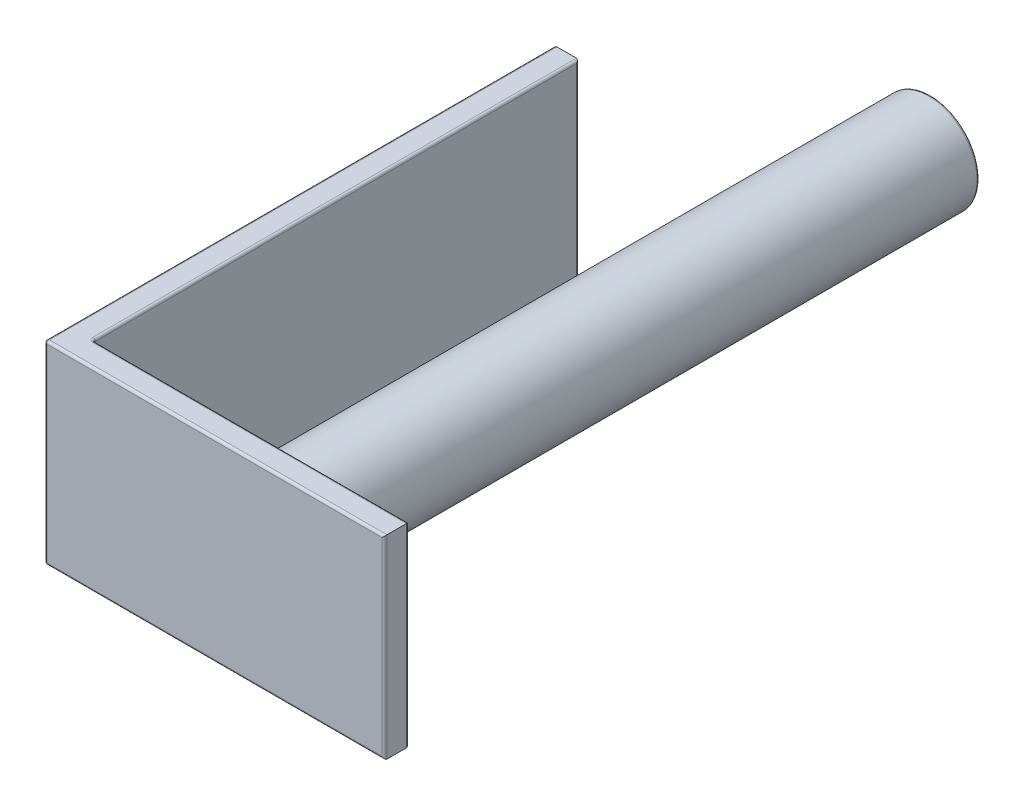
ISO-10303-21;
HEADER;
FILE_DESCRIPTION(('STEP AP214'),'2;1');
FILE_NAME('part.step','',(''),(''),'','','');
FILE_SCHEMA(('AUTOMOTIVE_DESIGN { 1 0 10303 214 1 1 1 1 }'));
ENDSEC;
DATA;
#1=APPLICATION_CONTEXT('core data for automotive mechanical design processes');
#2=APPLICATION_PROTOCOL_DEFINITION('international standard','automotive_design',2000,#1);
#3=PRODUCT_CONTEXT('',#1,'mechanical');
#4=PRODUCT('Part','Part','',(#3));
#5=PRODUCT_RELATED_PRODUCT_CATEGORY('part','',(#4));
#6=PRODUCT_DEFINITION_FORMATION('','',#4);
#7=PRODUCT_DEFINITION_CONTEXT('part definition',#1,'design');
#8=PRODUCT_DEFINITION('design','',#6,#7);
#9=PRODUCT_DEFINITION_SHAPE('','',#8);
#10=(LENGTH_UNIT() NAMED_UNIT(*) SI_UNIT(.MILLI.,.METRE.));
#11=(NAMED_UNIT(*) PLANE_ANGLE_UNIT() SI_UNIT($,.RADIAN.));
#12=(NAMED_UNIT(*) SI_UNIT($,.STERADIAN.) SOLID_ANGLE_UNIT());
#13=UNCERTAINTY_MEASURE_WITH_UNIT(LENGTH_MEASURE(1.E-05),#10,'distance_accuracy_value','');
#14=(GEOMETRIC_REPRESENTATION_CONTEXT(3) GLOBAL_UNCERTAINTY_ASSIGNED_CONTEXT((#13)) GLOBAL_UNIT_ASSIGNED_CONTEXT((#10,
#11,#12)) REPRESENTATION_CONTEXT('',''));
#15=CARTESIAN_POINT('',(0.,0.,0.));
#16=DIRECTION('',(0.,0.,1.));
#17=DIRECTION('',(1.,0.,0.));
#18=AXIS2_PLACEMENT_3D('',#15,#16,#17);
#19=CARTESIAN_POINT('',(0.,0.,-711.2));
#20=DIRECTION('',(0.,0.,1.));
#21=DIRECTION('',(1.,0.,0.));
#22=AXIS2_PLACEMENT_3D('',#19,#20,#21);
#23=CYLINDRICAL_SURFACE('',#22,50.8);
#24=CARTESIAN_POINT('',(0.,0.,-2.5400000000001));
#25=DIRECTION('',(0.,0.,1.));
#26=DIRECTION('',(1.,0.,0.));
#27=AXIS2_PLACEMENT_3D('',#24,#25,#26);
#28=CIRCLE('',#27,50.8);
#29=CARTESIAN_POINT('',(50.8,0.,-2.54000000000011));
#30=VERTEX_POINT('',#29);
#31=EDGE_CURVE('E244',#30,#30,#28,.F.);
#32=ORIENTED_EDGE('',*,*,#31,.T.);
#33=EDGE_LOOP('',(#32));
#34=FACE_BOUND('',#33,.T.);
#35=CARTESIAN_POINT('',(0.,0.,-708.66));
#36=DIRECTION('',(0.,0.,1.));
#37=DIRECTION('',(1.,0.,0.));
#38=AXIS2_PLACEMENT_3D('',#35,#36,#37);
#39=CIRCLE('',#38,50.8);
#40=CARTESIAN_POINT('',(50.8,0.,-708.66));
#41=VERTEX_POINT('',#40);
#42=EDGE_CURVE('E241',#41,#41,#39,.T.);
#43=ORIENTED_EDGE('',*,*,#42,.T.);
#44=EDGE_LOOP('',(#43));
#45=FACE_BOUND('',#44,.T.);
#46=ADVANCED_FACE('F39',(#34,#45),#23,.T.);
#47=CARTESIAN_POINT('',(0.,0.,-711.2));
#48=DIRECTION('',(0.,0.,1.));
#49=DIRECTION('',(1.,0.,0.));
#50=AXIS2_PLACEMENT_3D('',#47,#48,#49);
#51=PLANE('',#50);
#52=CARTESIAN_POINT('',(0.,0.,-711.2));
#53=DIRECTION('',(0.,0.,1.));
#54=DIRECTION('',(1.,0.,0.));
#55=AXIS2_PLACEMENT_3D('',#52,#53,#54);
#56=CIRCLE('',#55,48.26);
#57=CARTESIAN_POINT('',(48.26,0.,-711.2));
#58=VERTEX_POINT('',#57);
#59=EDGE_CURVE('E247',#58,#58,#56,.F.);
#60=ORIENTED_EDGE('',*,*,#59,.T.);
#61=EDGE_LOOP('',(#60));
#62=FACE_BOUND('',#61,.T.);
#63=ADVANCED_FACE('F347',(#62),#51,.F.);
#64=CARTESIAN_POINT('',(-165.1,101.6,0.));
#65=DIRECTION('',(-1.,0.,0.));
#66=DIRECTION('',(0.,0.,1.));
#67=AXIS2_PLACEMENT_3D('',#64,#65,#66);
#68=PLANE('',#67);
#69=DIRECTION('',(0.,-1.,0.));
#70=VECTOR('',#69,1.);
#71=CARTESIAN_POINT('',(-165.1,-101.6,-2.53999999999995));
#72=LINE('',#71,#70);
#73=CARTESIAN_POINT('',(-165.1,99.06,-2.53999999999995));
#74=VERTEX_POINT('',#73);
#75=CARTESIAN_POINT('',(-165.1,-99.06,-2.53999999999995));
#76=VERTEX_POINT('',#75);
#77=EDGE_CURVE('E166',#74,#76,#72,.T.);
#78=ORIENTED_EDGE('',*,*,#77,.T.);
#79=DIRECTION('',(0.,0.,-1.));
#80=VECTOR('',#79,1.);
#81=CARTESIAN_POINT('',(-165.1,-99.06,-508.));
#82=LINE('',#81,#80);
#83=CARTESIAN_POINT('',(-165.1,-99.06,-505.46));
#84=VERTEX_POINT('',#83);
#85=EDGE_CURVE('E64',#76,#84,#82,.T.);
#86=ORIENTED_EDGE('',*,*,#85,.T.);
#87=DIRECTION('',(0.,-1.,0.));
#88=VECTOR('',#87,1.);
#89=CARTESIAN_POINT('',(-165.1,101.6,-505.46));
#90=LINE('',#89,#88);
#91=CARTESIAN_POINT('',(-165.1,99.06,-505.46));
#92=VERTEX_POINT('',#91);
#93=EDGE_CURVE('E252',#84,#92,#90,.F.);
#94=ORIENTED_EDGE('',*,*,#93,.T.);
#95=DIRECTION('',(0.,0.,-1.));
#96=VECTOR('',#95,1.);
#97=CARTESIAN_POINT('',(-165.1,99.06,0.));
#98=LINE('',#97,#96);
#99=EDGE_CURVE('E250',#92,#74,#98,.F.);
#100=ORIENTED_EDGE('',*,*,#99,.T.);
#101=EDGE_LOOP('',(#78,#86,#94,#100));
#102=FACE_BOUND('',#101,.T.);
#103=ADVANCED_FACE('F353',(#102),#68,.F.);
#104=CARTESIAN_POINT('',(-190.5,101.6,-508.));
#105=DIRECTION('',(0.,0.,-1.));
#106=DIRECTION('',(-1.,0.,0.));
#107=AXIS2_PLACEMENT_3D('',#104,#105,#106);
#108=PLANE('',#107);
#109=DIRECTION('',(1.,0.,0.));
#110=VECTOR('',#109,1.);
#111=CARTESIAN_POINT('',(-190.5,-101.6,-508.));
#112=LINE('',#111,#110);
#113=CARTESIAN_POINT('',(-187.96,-101.6,-508.));
#114=VERTEX_POINT('',#113);
#115=CARTESIAN_POINT('',(-167.64,-101.6,-508.));
#116=VERTEX_POINT('',#115);
#117=EDGE_CURVE('E271',#114,#116,#112,.T.);
#118=ORIENTED_EDGE('',*,*,#117,.F.);
#119=DIRECTION('',(0.,-1.,0.));
#120=VECTOR('',#119,1.);
#121=CARTESIAN_POINT('',(-187.96,101.6,-508.));
#122=LINE('',#121,#120);
#123=CARTESIAN_POINT('',(-187.96,101.6,-508.));
#124=VERTEX_POINT('',#123);
#125=EDGE_CURVE('E11',#114,#124,#122,.F.);
#126=ORIENTED_EDGE('',*,*,#125,.T.);
#127=DIRECTION('',(1.,0.,0.));
#128=VECTOR('',#127,1.);
#129=CARTESIAN_POINT('',(-190.5,101.6,-508.));
#130=LINE('',#129,#128);
#131=CARTESIAN_POINT('',(-167.64,101.6,-508.));
#132=VERTEX_POINT('',#131);
#133=EDGE_CURVE('E188',#124,#132,#130,.T.);
#134=ORIENTED_EDGE('',*,*,#133,.T.);
#135=DIRECTION('',(0.,-1.,0.));
#136=VECTOR('',#135,1.);
#137=CARTESIAN_POINT('',(-167.64,-101.6,-508.));
#138=LINE('',#137,#136);
#139=EDGE_CURVE('E48',#132,#116,#138,.T.);
#140=ORIENTED_EDGE('',*,*,#139,.T.);
#141=EDGE_LOOP('',(#118,#126,#134,#140));
#142=FACE_BOUND('',#141,.T.);
#143=ADVANCED_FACE('F597',(#142),#108,.T.);
#144=CARTESIAN_POINT('',(-190.5,101.6,0.));
#145=DIRECTION('',(-1.,0.,0.));
#146=DIRECTION('',(0.,0.,1.));
#147=AXIS2_PLACEMENT_3D('',#144,#145,#146);
#148=PLANE('',#147);
#149=DIRECTION('',(0.,-1.,0.));
#150=VECTOR('',#149,1.);
#151=CARTESIAN_POINT('',(-190.5,101.6,22.8600000000001));
#152=LINE('',#151,#150);
#153=CARTESIAN_POINT('',(-190.5,-99.06,22.8600000000001));
#154=VERTEX_POINT('',#153);
#155=CARTESIAN_POINT('',(-190.5,99.06,22.8600000000001));
#156=VERTEX_POINT('',#155);
#157=EDGE_CURVE('E222',#154,#156,#152,.F.);
#158=ORIENTED_EDGE('',*,*,#157,.T.);
#159=DIRECTION('',(0.,0.,-1.));
#160=VECTOR('',#159,1.);
#161=CARTESIAN_POINT('',(-190.5,99.06,-508.));
#162=LINE('',#161,#160);
#163=CARTESIAN_POINT('',(-190.5,99.06,-505.46));
#164=VERTEX_POINT('',#163);
#165=EDGE_CURVE('E225',#156,#164,#162,.T.);
#166=ORIENTED_EDGE('',*,*,#165,.T.);
#167=DIRECTION('',(0.,-1.,0.));
#168=VECTOR('',#167,1.);
#169=CARTESIAN_POINT('',(-190.5,101.6,-505.46));
#170=LINE('',#169,#168);
#171=CARTESIAN_POINT('',(-190.5,-99.06,-505.46));
#172=VERTEX_POINT('',#171);
#173=EDGE_CURVE('E220',#164,#172,#170,.T.);
#174=ORIENTED_EDGE('',*,*,#173,.T.);
#175=DIRECTION('',(0.,0.,-1.));
#176=VECTOR('',#175,1.);
#177=CARTESIAN_POINT('',(-190.5,-99.06,0.));
#178=LINE('',#177,#176);
#179=EDGE_CURVE('E218',#172,#154,#178,.F.);
#180=ORIENTED_EDGE('',*,*,#179,.T.);
#181=EDGE_LOOP('',(#158,#166,#174,#180));
#182=FACE_BOUND('',#181,.T.);
#183=ADVANCED_FACE('F313',(#182),#148,.T.);
#184=CARTESIAN_POINT('',(165.1,101.6,25.3999999999999));
#185=DIRECTION('',(0.,0.,1.));
#186=DIRECTION('',(1.,0.,0.));
#187=AXIS2_PLACEMENT_3D('',#184,#185,#186);
#188=PLANE('',#187);
#189=DIRECTION('',(-1.,0.,0.));
#190=VECTOR('',#189,1.);
#191=CARTESIAN_POINT('',(-190.5,99.06,25.4000000000001));
#192=LINE('',#191,#190);
#193=CARTESIAN_POINT('',(162.56,99.06,25.3999999999999));
#194=VERTEX_POINT('',#193);
#195=CARTESIAN_POINT('',(-187.96,99.06,25.4000000000001));
#196=VERTEX_POINT('',#195);
#197=EDGE_CURVE('E213',#194,#196,#192,.T.);
#198=ORIENTED_EDGE('',*,*,#197,.T.);
#199=DIRECTION('',(0.,-1.,0.));
#200=VECTOR('',#199,1.);
#201=CARTESIAN_POINT('',(-187.96,101.6,25.4000000000001));
#202=LINE('',#201,#200);
#203=CARTESIAN_POINT('',(-187.96,-99.06,25.4000000000001));
#204=VERTEX_POINT('',#203);
#205=EDGE_CURVE('E215',#196,#204,#202,.T.);
#206=ORIENTED_EDGE('',*,*,#205,.T.);
#207=DIRECTION('',(-1.,0.,0.));
#208=VECTOR('',#207,1.);
#209=CARTESIAN_POINT('',(165.1,-99.06,25.3999999999999));
#210=LINE('',#209,#208);
#211=CARTESIAN_POINT('',(162.56,-99.06,25.3999999999999));
#212=VERTEX_POINT('',#211);
#213=EDGE_CURVE('E209',#204,#212,#210,.F.);
#214=ORIENTED_EDGE('',*,*,#213,.T.);
#215=DIRECTION('',(0.,-1.,0.));
#216=VECTOR('',#215,1.);
#217=CARTESIAN_POINT('',(162.56,101.6,25.3999999999999));
#218=LINE('',#217,#216);
#219=EDGE_CURVE('E211',#212,#194,#218,.F.);
#220=ORIENTED_EDGE('',*,*,#219,.T.);
#221=EDGE_LOOP('',(#198,#206,#214,#220));
#222=FACE_BOUND('',#221,.T.);
#223=ADVANCED_FACE('F331',(#222),#188,.T.);
#224=CARTESIAN_POINT('',(165.1,101.6,0.));
#225=DIRECTION('',(1.,0.,0.));
#226=DIRECTION('',(0.,0.,-1.));
#227=AXIS2_PLACEMENT_3D('',#224,#225,#226);
#228=PLANE('',#227);
#229=DIRECTION('',(0.,0.,1.));
#230=VECTOR('',#229,1.);
#231=CARTESIAN_POINT('',(165.1,101.6,0.));
#232=LINE('',#231,#230);
#233=CARTESIAN_POINT('',(165.1,101.6,2.53999999999995));
#234=VERTEX_POINT('',#233);
#235=CARTESIAN_POINT('',(165.1,101.6,22.8599999999999));
#236=VERTEX_POINT('',#235);
#237=EDGE_CURVE('E184',#234,#236,#232,.T.);
#238=ORIENTED_EDGE('',*,*,#237,.T.);
#239=DIRECTION('',(0.,-1.,0.));
#240=VECTOR('',#239,1.);
#241=CARTESIAN_POINT('',(165.1,101.6,22.8599999999999));
#242=LINE('',#241,#240);
#243=CARTESIAN_POINT('',(165.1,-101.6,22.86));
#244=VERTEX_POINT('',#243);
#245=EDGE_CURVE('E239',#236,#244,#242,.T.);
#246=ORIENTED_EDGE('',*,*,#245,.T.);
#247=DIRECTION('',(0.,0.,1.));
#248=VECTOR('',#247,1.);
#249=CARTESIAN_POINT('',(165.1,-101.6,0.));
#250=LINE('',#249,#248);
#251=CARTESIAN_POINT('',(165.1,-101.6,2.53999999999995));
#252=VERTEX_POINT('',#251);
#253=EDGE_CURVE('E191',#252,#244,#250,.T.);
#254=ORIENTED_EDGE('',*,*,#253,.F.);
#255=DIRECTION('',(0.,-1.,0.));
#256=VECTOR('',#255,1.);
#257=CARTESIAN_POINT('',(165.1,101.6,2.53999999999995));
#258=LINE('',#257,#256);
#259=EDGE_CURVE('E237',#252,#234,#258,.F.);
#260=ORIENTED_EDGE('',*,*,#259,.T.);
#261=EDGE_LOOP('',(#238,#246,#254,#260));
#262=FACE_BOUND('',#261,.T.);
#263=ADVANCED_FACE('F570',(#262),#228,.T.);
#264=CARTESIAN_POINT('',(165.1,101.6,0.));
#265=DIRECTION('',(0.,0.,1.));
#266=DIRECTION('',(1.,0.,0.));
#267=AXIS2_PLACEMENT_3D('',#264,#265,#266);
#268=PLANE('',#267);
#269=CARTESIAN_POINT('',(0.,0.,0.));
#270=DIRECTION('',(0.,0.,1.));
#271=DIRECTION('',(1.,0.,0.));
#272=AXIS2_PLACEMENT_3D('',#269,#270,#271);
#273=CIRCLE('',#272,53.34);
#274=CARTESIAN_POINT('',(53.34,0.,0.));
#275=VERTEX_POINT('',#274);
#276=EDGE_CURVE('E195',#275,#275,#273,.T.);
#277=ORIENTED_EDGE('',*,*,#276,.T.);
#278=EDGE_LOOP('',(#277));
#279=FACE_BOUND('',#278,.T.);
#280=DIRECTION('',(0.,-1.,0.));
#281=VECTOR('',#280,1.);
#282=CARTESIAN_POINT('',(162.56,-101.6,0.));
#283=LINE('',#282,#281);
#284=CARTESIAN_POINT('',(162.56,99.06,0.));
#285=VERTEX_POINT('',#284);
#286=CARTESIAN_POINT('',(162.56,-99.06,0.));
#287=VERTEX_POINT('',#286);
#288=EDGE_CURVE('E159',#285,#287,#283,.T.);
#289=ORIENTED_EDGE('',*,*,#288,.T.);
#290=DIRECTION('',(-1.,0.,0.));
#291=VECTOR('',#290,1.);
#292=CARTESIAN_POINT('',(-165.1,-99.06,0.));
#293=LINE('',#292,#291);
#294=CARTESIAN_POINT('',(-162.56,-99.06,0.));
#295=VERTEX_POINT('',#294);
#296=EDGE_CURVE('E157',#287,#295,#293,.T.);
#297=ORIENTED_EDGE('',*,*,#296,.T.);
#298=DIRECTION('',(0.,-1.,0.));
#299=VECTOR('',#298,1.);
#300=CARTESIAN_POINT('',(-162.56,101.6,0.));
#301=LINE('',#300,#299);
#302=CARTESIAN_POINT('',(-162.56,99.06,0.));
#303=VERTEX_POINT('',#302);
#304=EDGE_CURVE('E150',#295,#303,#301,.F.);
#305=ORIENTED_EDGE('',*,*,#304,.T.);
#306=DIRECTION('',(-1.,0.,0.));
#307=VECTOR('',#306,1.);
#308=CARTESIAN_POINT('',(165.1,99.06,0.));
#309=LINE('',#308,#307);
#310=EDGE_CURVE('E154',#303,#285,#309,.F.);
#311=ORIENTED_EDGE('',*,*,#310,.T.);
#312=EDGE_LOOP('',(#289,#297,#305,#311));
#313=FACE_BOUND('',#312,.T.);
#314=ADVANCED_FACE('F152',(#279,#313),#268,.F.);
#315=CARTESIAN_POINT('',(0.,101.6,0.));
#316=DIRECTION('',(0.,-1.,0.));
#317=DIRECTION('',(-1.,0.,0.));
#318=AXIS2_PLACEMENT_3D('',#315,#316,#317);
#319=PLANE('',#318);
#320=DIRECTION('',(0.,0.,-1.));
#321=VECTOR('',#320,1.);
#322=CARTESIAN_POINT('',(-187.96,101.6,25.4000000000001));
#323=LINE('',#322,#321);
#324=CARTESIAN_POINT('',(-187.96,101.6,22.8600000000001));
#325=VERTEX_POINT('',#324);
#326=EDGE_CURVE('E232',#124,#325,#323,.F.);
#327=ORIENTED_EDGE('',*,*,#326,.T.);
#328=DIRECTION('',(-1.,0.,0.));
#329=VECTOR('',#328,1.);
#330=CARTESIAN_POINT('',(165.1,101.6,22.8599999999999));
#331=LINE('',#330,#329);
#332=EDGE_CURVE('E234',#325,#236,#331,.F.);
#333=ORIENTED_EDGE('',*,*,#332,.T.);
#334=ORIENTED_EDGE('',*,*,#237,.F.);
#335=DIRECTION('',(-1.,0.,0.));
#336=VECTOR('',#335,1.);
#337=CARTESIAN_POINT('',(0.,101.6,2.54));
#338=LINE('',#337,#336);
#339=CARTESIAN_POINT('',(-162.56,101.6,2.54000000000005));
#340=VERTEX_POINT('',#339);
#341=EDGE_CURVE('E228',#234,#340,#338,.T.);
#342=ORIENTED_EDGE('',*,*,#341,.T.);
#343=CARTESIAN_POINT('',(-162.56,101.6,-2.53999999999995));
#344=DIRECTION('',(0.,-1.,0.));
#345=DIRECTION('',(0.,0.,-1.));
#346=AXIS2_PLACEMENT_3D('',#343,#344,#345);
#347=CIRCLE('',#346,5.08);
#348=CARTESIAN_POINT('',(-167.64,101.6,-2.53999999999995));
#349=VERTEX_POINT('',#348);
#350=EDGE_CURVE('E175',#349,#340,#347,.F.);
#351=ORIENTED_EDGE('',*,*,#350,.F.);
#352=DIRECTION('',(0.,0.,-1.));
#353=VECTOR('',#352,1.);
#354=CARTESIAN_POINT('',(-167.64,101.6,0.));
#355=LINE('',#354,#353);
#356=EDGE_CURVE('E230',#349,#132,#355,.T.);
#357=ORIENTED_EDGE('',*,*,#356,.T.);
#358=ORIENTED_EDGE('',*,*,#133,.F.);
#359=EDGE_LOOP('',(#327,#333,#334,#342,#351,#357,#358));
#360=FACE_BOUND('',#359,.T.);
#361=ADVANCED_FACE('F551',(#360),#319,.F.);
#362=CARTESIAN_POINT('',(0.,-101.6,0.));
#363=DIRECTION('',(0.,-1.,0.));
#364=DIRECTION('',(-1.,0.,0.));
#365=AXIS2_PLACEMENT_3D('',#362,#363,#364);
#366=PLANE('',#365);
#367=CARTESIAN_POINT('',(-162.56,-101.6,-2.53999999999995));
#368=DIRECTION('',(0.,-1.,0.));
#369=DIRECTION('',(0.,0.,-1.));
#370=AXIS2_PLACEMENT_3D('',#367,#368,#369);
#371=CIRCLE('',#370,5.08);
#372=CARTESIAN_POINT('',(-162.56,-101.6,2.54000000000005));
#373=VERTEX_POINT('',#372);
#374=CARTESIAN_POINT('',(-167.64,-101.6,-2.53999999999995));
#375=VERTEX_POINT('',#374);
#376=EDGE_CURVE('E202',#373,#375,#371,.T.);
#377=ORIENTED_EDGE('',*,*,#376,.F.);
#378=DIRECTION('',(-1.,0.,0.));
#379=VECTOR('',#378,1.);
#380=CARTESIAN_POINT('',(165.1,-101.6,2.53999999999995));
#381=LINE('',#380,#379);
#382=EDGE_CURVE('E206',#373,#252,#381,.F.);
#383=ORIENTED_EDGE('',*,*,#382,.T.);
#384=ORIENTED_EDGE('',*,*,#253,.T.);
#385=DIRECTION('',(-1.,0.,0.));
#386=VECTOR('',#385,1.);
#387=CARTESIAN_POINT('',(0.,-101.6,22.86));
#388=LINE('',#387,#386);
#389=CARTESIAN_POINT('',(-187.96,-101.6,22.8600000000001));
#390=VERTEX_POINT('',#389);
#391=EDGE_CURVE('E200',#244,#390,#388,.T.);
#392=ORIENTED_EDGE('',*,*,#391,.T.);
#393=DIRECTION('',(0.,0.,-1.));
#394=VECTOR('',#393,1.);
#395=CARTESIAN_POINT('',(-187.96,-101.6,0.));
#396=LINE('',#395,#394);
#397=EDGE_CURVE('E198',#390,#114,#396,.T.);
#398=ORIENTED_EDGE('',*,*,#397,.T.);
#399=ORIENTED_EDGE('',*,*,#117,.T.);
#400=DIRECTION('',(0.,0.,-1.));
#401=VECTOR('',#400,1.);
#402=CARTESIAN_POINT('',(-167.64,-101.6,0.));
#403=LINE('',#402,#401);
#404=EDGE_CURVE('E204',#116,#375,#403,.F.);
#405=ORIENTED_EDGE('',*,*,#404,.T.);
#406=EDGE_LOOP('',(#377,#383,#384,#392,#398,#399,#405));
#407=FACE_BOUND('',#406,.T.);
#408=ADVANCED_FACE('F388',(#407),#366,.T.);
#409=CARTESIAN_POINT('',(-167.64,99.06,0.));
#410=DIRECTION('',(0.,0.,-1.));
#411=DIRECTION('',(-1.,0.,0.));
#412=AXIS2_PLACEMENT_3D('',#409,#410,#411);
#413=CYLINDRICAL_SURFACE('',#412,2.54);
#414=CARTESIAN_POINT('',(-167.64,99.06,-505.46));
#415=DIRECTION('',(0.,-0.707106781186547,-0.707106781186547));
#416=DIRECTION('',(0.,0.707106781186547,-0.707106781186547));
#417=AXIS2_PLACEMENT_3D('',#414,#415,#416);
#418=ELLIPSE('',#417,3.59210244842766,2.54);
#419=EDGE_CURVE('E178',#132,#92,#418,.T.);
#420=ORIENTED_EDGE('',*,*,#419,.F.);
#421=ORIENTED_EDGE('',*,*,#356,.F.);
#422=CARTESIAN_POINT('',(-167.64,99.06,-2.53999999999995));
#423=DIRECTION('',(0.,0.,1.));
#424=DIRECTION('',(1.,0.,0.));
#425=AXIS2_PLACEMENT_3D('',#422,#423,#424);
#426=CIRCLE('',#425,2.54);
#427=EDGE_CURVE('E269',#74,#349,#426,.T.);
#428=ORIENTED_EDGE('',*,*,#427,.F.);
#429=ORIENTED_EDGE('',*,*,#99,.F.);
#430=EDGE_LOOP('',(#420,#421,#428,#429));
#431=FACE_BOUND('',#430,.T.);
#432=ADVANCED_FACE('F385',(#431),#413,.T.);
#433=CARTESIAN_POINT('',(-162.56,99.06,-2.53999999999995));
#434=DIRECTION('',(0.,-1.,0.));
#435=DIRECTION('',(0.,0.,-1.));
#436=AXIS2_PLACEMENT_3D('',#433,#434,#435);
#437=TOROIDAL_SURFACE('',#436,5.08,2.54);
#438=ORIENTED_EDGE('',*,*,#427,.T.);
#439=ORIENTED_EDGE('',*,*,#350,.T.);
#440=CARTESIAN_POINT('',(-162.56,99.06,2.54000000000005));
#441=DIRECTION('',(-1.,0.,0.));
#442=DIRECTION('',(0.,0.,1.));
#443=AXIS2_PLACEMENT_3D('',#440,#441,#442);
#444=CIRCLE('',#443,2.54);
#445=EDGE_CURVE('E169',#303,#340,#444,.F.);
#446=ORIENTED_EDGE('',*,*,#445,.F.);
#447=CARTESIAN_POINT('',(-162.56,99.06,-2.53999999999995));
#448=DIRECTION('',(0.,-1.,0.));
#449=DIRECTION('',(0.,0.,-1.));
#450=AXIS2_PLACEMENT_3D('',#447,#448,#449);
#451=CIRCLE('',#450,2.54);
#452=EDGE_CURVE('E163',#74,#303,#451,.F.);
#453=ORIENTED_EDGE('',*,*,#452,.F.);
#454=EDGE_LOOP('',(#438,#439,#446,#453));
#455=FACE_BOUND('',#454,.T.);
#456=ADVANCED_FACE('F174',(#455),#437,.T.);
#457=CARTESIAN_POINT('',(-167.64,101.6,-505.46));
#458=DIRECTION('',(0.,1.,0.));
#459=DIRECTION('',(0.,0.,1.));
#460=AXIS2_PLACEMENT_3D('',#457,#458,#459);
#461=CYLINDRICAL_SURFACE('',#460,2.54);
#462=ORIENTED_EDGE('',*,*,#419,.T.);
#463=ORIENTED_EDGE('',*,*,#93,.F.);
#464=CARTESIAN_POINT('',(-167.64,-99.06,-505.46));
#465=DIRECTION('',(0.,-0.707106781186547,0.707106781186547));
#466=DIRECTION('',(0.,0.707106781186547,0.707106781186547));
#467=AXIS2_PLACEMENT_3D('',#464,#465,#466);
#468=ELLIPSE('',#467,3.59210244842766,2.54);
#469=EDGE_CURVE('E170',#116,#84,#468,.T.);
#470=ORIENTED_EDGE('',*,*,#469,.F.);
#471=ORIENTED_EDGE('',*,*,#139,.F.);
#472=EDGE_LOOP('',(#462,#463,#470,#471));
#473=FACE_BOUND('',#472,.T.);
#474=ADVANCED_FACE('F379',(#473),#461,.T.);
#475=CARTESIAN_POINT('',(0.,99.06,2.54));
#476=DIRECTION('',(-1.,0.,0.));
#477=DIRECTION('',(0.,0.,1.));
#478=AXIS2_PLACEMENT_3D('',#475,#476,#477);
#479=CYLINDRICAL_SURFACE('',#478,2.54);
#480=ORIENTED_EDGE('',*,*,#445,.T.);
#481=ORIENTED_EDGE('',*,*,#341,.F.);
#482=CARTESIAN_POINT('',(162.56,99.06,2.53999999999995));
#483=DIRECTION('',(-0.707106781186547,0.707106781186547,0.));
#484=DIRECTION('',(-0.707106781186547,-0.707106781186547,0.));
#485=AXIS2_PLACEMENT_3D('',#482,#483,#484);
#486=ELLIPSE('',#485,3.59210244842766,2.54);
#487=EDGE_CURVE('E182',#285,#234,#486,.F.);
#488=ORIENTED_EDGE('',*,*,#487,.F.);
#489=ORIENTED_EDGE('',*,*,#310,.F.);
#490=EDGE_LOOP('',(#480,#481,#488,#489));
#491=FACE_BOUND('',#490,.T.);
#492=ADVANCED_FACE('F180',(#491),#479,.T.);
#493=CARTESIAN_POINT('',(-162.56,101.6,-2.53999999999995));
#494=DIRECTION('',(0.,1.,0.));
#495=DIRECTION('',(0.,0.,1.));
#496=AXIS2_PLACEMENT_3D('',#493,#494,#495);
#497=CYLINDRICAL_SURFACE('',#496,2.54);
#498=ORIENTED_EDGE('',*,*,#452,.T.);
#499=ORIENTED_EDGE('',*,*,#304,.F.);
#500=CARTESIAN_POINT('',(-162.56,-99.06,-2.53999999999995));
#501=DIRECTION('',(0.,-1.,0.));
#502=DIRECTION('',(0.,0.,-1.));
#503=AXIS2_PLACEMENT_3D('',#500,#501,#502);
#504=CIRCLE('',#503,2.54);
#505=EDGE_CURVE('E262',#76,#295,#504,.F.);
#506=ORIENTED_EDGE('',*,*,#505,.F.);
#507=ORIENTED_EDGE('',*,*,#77,.F.);
#508=EDGE_LOOP('',(#498,#499,#506,#507));
#509=FACE_BOUND('',#508,.T.);
#510=ADVANCED_FACE('F165',(#509),#497,.F.);
#511=CARTESIAN_POINT('',(-167.64,-99.06,0.));
#512=DIRECTION('',(0.,0.,1.));
#513=DIRECTION('',(1.,0.,0.));
#514=AXIS2_PLACEMENT_3D('',#511,#512,#513);
#515=CYLINDRICAL_SURFACE('',#514,2.54);
#516=ORIENTED_EDGE('',*,*,#469,.T.);
#517=ORIENTED_EDGE('',*,*,#85,.F.);
#518=CARTESIAN_POINT('',(-167.64,-99.06,-2.53999999999995));
#519=DIRECTION('',(0.,0.,1.));
#520=DIRECTION('',(1.,0.,0.));
#521=AXIS2_PLACEMENT_3D('',#518,#519,#520);
#522=CIRCLE('',#521,2.54);
#523=EDGE_CURVE('E56',#375,#76,#522,.T.);
#524=ORIENTED_EDGE('',*,*,#523,.F.);
#525=ORIENTED_EDGE('',*,*,#404,.F.);
#526=EDGE_LOOP('',(#516,#517,#524,#525));
#527=FACE_BOUND('',#526,.T.);
#528=ADVANCED_FACE('F370',(#527),#515,.T.);
#529=CARTESIAN_POINT('',(162.56,101.6,2.53999999999995));
#530=DIRECTION('',(0.,1.,0.));
#531=DIRECTION('',(0.,0.,1.));
#532=AXIS2_PLACEMENT_3D('',#529,#530,#531);
#533=CYLINDRICAL_SURFACE('',#532,2.54);
#534=ORIENTED_EDGE('',*,*,#487,.T.);
#535=ORIENTED_EDGE('',*,*,#259,.F.);
#536=CARTESIAN_POINT('',(162.56,-99.06,2.53999999999995));
#537=DIRECTION('',(0.707106781186547,0.707106781186547,0.));
#538=DIRECTION('',(-0.707106781186547,0.707106781186547,0.));
#539=AXIS2_PLACEMENT_3D('',#536,#537,#538);
#540=ELLIPSE('',#539,3.59210244842766,2.54);
#541=EDGE_CURVE('E259',#287,#252,#540,.F.);
#542=ORIENTED_EDGE('',*,*,#541,.F.);
#543=ORIENTED_EDGE('',*,*,#288,.F.);
#544=EDGE_LOOP('',(#534,#535,#542,#543));
#545=FACE_BOUND('',#544,.T.);
#546=ADVANCED_FACE('F367',(#545),#533,.T.);
#547=CARTESIAN_POINT('',(-162.56,-99.06,-2.53999999999995));
#548=DIRECTION('',(0.,-1.,0.));
#549=DIRECTION('',(0.,0.,-1.));
#550=AXIS2_PLACEMENT_3D('',#547,#548,#549);
#551=TOROIDAL_SURFACE('',#550,5.08,2.54);
#552=ORIENTED_EDGE('',*,*,#523,.T.);
#553=ORIENTED_EDGE('',*,*,#505,.T.);
#554=CARTESIAN_POINT('',(-162.56,-99.06,2.54000000000005));
#555=DIRECTION('',(-1.,0.,0.));
#556=DIRECTION('',(0.,0.,1.));
#557=AXIS2_PLACEMENT_3D('',#554,#555,#556);
#558=CIRCLE('',#557,2.54);
#559=EDGE_CURVE('E257',#373,#295,#558,.F.);
#560=ORIENTED_EDGE('',*,*,#559,.F.);
#561=ORIENTED_EDGE('',*,*,#376,.T.);
#562=EDGE_LOOP('',(#552,#553,#560,#561));
#563=FACE_BOUND('',#562,.T.);
#564=ADVANCED_FACE('F363',(#563),#551,.T.);
#565=CARTESIAN_POINT('',(165.1,-99.06,2.53999999999995));
#566=DIRECTION('',(1.,0.,0.));
#567=DIRECTION('',(0.,0.,-1.));
#568=AXIS2_PLACEMENT_3D('',#565,#566,#567);
#569=CYLINDRICAL_SURFACE('',#568,2.54);
#570=ORIENTED_EDGE('',*,*,#541,.T.);
#571=ORIENTED_EDGE('',*,*,#382,.F.);
#572=ORIENTED_EDGE('',*,*,#559,.T.);
#573=ORIENTED_EDGE('',*,*,#296,.F.);
#574=EDGE_LOOP('',(#570,#571,#572,#573));
#575=FACE_BOUND('',#574,.T.);
#576=ADVANCED_FACE('F359',(#575),#569,.T.);
#577=CARTESIAN_POINT('',(162.56,101.6,22.8599999999999));
#578=DIRECTION('',(0.,-1.,0.));
#579=DIRECTION('',(0.,0.,-1.));
#580=AXIS2_PLACEMENT_3D('',#577,#578,#579);
#581=CYLINDRICAL_SURFACE('',#580,2.54);
#582=CARTESIAN_POINT('',(162.56,-99.06,22.8599999999999));
#583=DIRECTION('',(-0.707106781186547,-0.707106781186547,0.));
#584=DIRECTION('',(-0.707106781186547,0.707106781186547,0.));
#585=AXIS2_PLACEMENT_3D('',#582,#583,#584);
#586=ELLIPSE('',#585,3.59210244842766,2.54);
#587=EDGE_CURVE('E291',#244,#212,#586,.T.);
#588=ORIENTED_EDGE('',*,*,#587,.F.);
#589=ORIENTED_EDGE('',*,*,#245,.F.);
#590=CARTESIAN_POINT('',(162.56,99.06,22.8599999999999));
#591=DIRECTION('',(0.707106781186547,-0.707106781186547,0.));
#592=DIRECTION('',(-0.707106781186547,-0.707106781186547,0.));
#593=AXIS2_PLACEMENT_3D('',#590,#591,#592);
#594=ELLIPSE('',#593,3.59210244842766,2.54);
#595=EDGE_CURVE('E293',#194,#236,#594,.F.);
#596=ORIENTED_EDGE('',*,*,#595,.F.);
#597=ORIENTED_EDGE('',*,*,#219,.F.);
#598=EDGE_LOOP('',(#588,#589,#596,#597));
#599=FACE_BOUND('',#598,.T.);
#600=ADVANCED_FACE('F362',(#599),#581,.T.);
#601=CARTESIAN_POINT('',(-187.96,101.6,-505.46));
#602=DIRECTION('',(0.,-1.,0.));
#603=DIRECTION('',(0.,0.,-1.));
#604=AXIS2_PLACEMENT_3D('',#601,#602,#603);
#605=CYLINDRICAL_SURFACE('',#604,2.54);
#606=CARTESIAN_POINT('',(-187.96,-99.06,-505.46));
#607=DIRECTION('',(0.,0.707106781186547,-0.707106781186547));
#608=DIRECTION('',(0.,-0.707106781186547,-0.707106781186547));
#609=AXIS2_PLACEMENT_3D('',#606,#607,#608);
#610=ELLIPSE('',#609,3.59210244842766,2.54);
#611=EDGE_CURVE('E288',#172,#114,#610,.F.);
#612=ORIENTED_EDGE('',*,*,#611,.F.);
#613=ORIENTED_EDGE('',*,*,#173,.F.);
#614=CARTESIAN_POINT('',(-187.96,99.06,-505.46));
#615=DIRECTION('',(0.,0.707106781186547,0.707106781186547));
#616=DIRECTION('',(0.,-0.707106781186547,0.707106781186547));
#617=AXIS2_PLACEMENT_3D('',#614,#615,#616);
#618=ELLIPSE('',#617,3.59210244842766,2.54);
#619=EDGE_CURVE('E43',#124,#164,#618,.T.);
#620=ORIENTED_EDGE('',*,*,#619,.F.);
#621=ORIENTED_EDGE('',*,*,#125,.F.);
#622=EDGE_LOOP('',(#612,#613,#620,#621));
#623=FACE_BOUND('',#622,.T.);
#624=ADVANCED_FACE('F310',(#623),#605,.T.);
#625=CARTESIAN_POINT('',(-187.96,99.06,0.));
#626=DIRECTION('',(0.,0.,1.));
#627=DIRECTION('',(1.,0.,0.));
#628=AXIS2_PLACEMENT_3D('',#625,#626,#627);
#629=CYLINDRICAL_SURFACE('',#628,2.54);
#630=ORIENTED_EDGE('',*,*,#619,.T.);
#631=ORIENTED_EDGE('',*,*,#165,.F.);
#632=CARTESIAN_POINT('',(-187.96,99.06,22.8600000000001));
#633=DIRECTION('',(0.,0.,1.));
#634=DIRECTION('',(1.,0.,0.));
#635=AXIS2_PLACEMENT_3D('',#632,#633,#634);
#636=CIRCLE('',#635,2.54);
#637=EDGE_CURVE('E285',#325,#156,#636,.T.);
#638=ORIENTED_EDGE('',*,*,#637,.F.);
#639=ORIENTED_EDGE('',*,*,#326,.F.);
#640=EDGE_LOOP('',(#630,#631,#638,#639));
#641=FACE_BOUND('',#640,.T.);
#642=ADVANCED_FACE('F304',(#641),#629,.T.);
#643=CARTESIAN_POINT('',(165.1,99.06,22.8599999999999));
#644=DIRECTION('',(1.,0.,0.));
#645=DIRECTION('',(0.,0.,-1.));
#646=AXIS2_PLACEMENT_3D('',#643,#644,#645);
#647=CYLINDRICAL_SURFACE('',#646,2.54);
#648=ORIENTED_EDGE('',*,*,#595,.T.);
#649=ORIENTED_EDGE('',*,*,#332,.F.);
#650=CARTESIAN_POINT('',(-187.96,99.06,22.8600000000001));
#651=DIRECTION('',(-1.,0.,0.));
#652=DIRECTION('',(0.,-1.,0.));
#653=AXIS2_PLACEMENT_3D('',#650,#651,#652);
#654=CIRCLE('',#653,2.54);
#655=EDGE_CURVE('E282',#196,#325,#654,.T.);
#656=ORIENTED_EDGE('',*,*,#655,.F.);
#657=ORIENTED_EDGE('',*,*,#197,.F.);
#658=EDGE_LOOP('',(#648,#649,#656,#657));
#659=FACE_BOUND('',#658,.T.);
#660=ADVANCED_FACE('F333',(#659),#647,.T.);
#661=CARTESIAN_POINT('',(0.,-99.06,22.86));
#662=DIRECTION('',(-1.,0.,0.));
#663=DIRECTION('',(0.,0.,1.));
#664=AXIS2_PLACEMENT_3D('',#661,#662,#663);
#665=CYLINDRICAL_SURFACE('',#664,2.54);
#666=ORIENTED_EDGE('',*,*,#587,.T.);
#667=ORIENTED_EDGE('',*,*,#213,.F.);
#668=CARTESIAN_POINT('',(-187.96,-99.06,22.8600000000001));
#669=DIRECTION('',(-1.,0.,0.));
#670=DIRECTION('',(0.,0.,1.));
#671=AXIS2_PLACEMENT_3D('',#668,#669,#670);
#672=CIRCLE('',#671,2.54);
#673=EDGE_CURVE('E279',#390,#204,#672,.T.);
#674=ORIENTED_EDGE('',*,*,#673,.F.);
#675=ORIENTED_EDGE('',*,*,#391,.F.);
#676=EDGE_LOOP('',(#666,#667,#674,#675));
#677=FACE_BOUND('',#676,.T.);
#678=ADVANCED_FACE('F327',(#677),#665,.T.);
#679=CARTESIAN_POINT('',(-187.96,-99.06,0.));
#680=DIRECTION('',(0.,0.,-1.));
#681=DIRECTION('',(-1.,0.,0.));
#682=AXIS2_PLACEMENT_3D('',#679,#680,#681);
#683=CYLINDRICAL_SURFACE('',#682,2.54);
#684=ORIENTED_EDGE('',*,*,#611,.T.);
#685=ORIENTED_EDGE('',*,*,#397,.F.);
#686=CARTESIAN_POINT('',(-187.96,-99.06,22.8600000000001));
#687=DIRECTION('',(0.,0.,1.));
#688=DIRECTION('',(0.,-1.,0.));
#689=AXIS2_PLACEMENT_3D('',#686,#687,#688);
#690=CIRCLE('',#689,2.54);
#691=EDGE_CURVE('E276',#154,#390,#690,.T.);
#692=ORIENTED_EDGE('',*,*,#691,.F.);
#693=ORIENTED_EDGE('',*,*,#179,.F.);
#694=EDGE_LOOP('',(#684,#685,#692,#693));
#695=FACE_BOUND('',#694,.T.);
#696=ADVANCED_FACE('F337',(#695),#683,.T.);
#697=CARTESIAN_POINT('',(-187.96,99.06,22.8600000000001));
#698=DIRECTION('',(0.,1.,0.));
#699=DIRECTION('',(0.,0.,1.));
#700=AXIS2_PLACEMENT_3D('',#697,#698,#699);
#701=SPHERICAL_SURFACE('',#700,2.54);
#702=ORIENTED_EDGE('',*,*,#655,.T.);
#703=ORIENTED_EDGE('',*,*,#637,.T.);
#704=CARTESIAN_POINT('',(-187.96,99.06,22.8600000000001));
#705=DIRECTION('',(0.,1.,0.));
#706=DIRECTION('',(0.,0.,1.));
#707=AXIS2_PLACEMENT_3D('',#704,#705,#706);
#708=CIRCLE('',#707,2.54);
#709=EDGE_CURVE('E274',#196,#156,#708,.F.);
#710=ORIENTED_EDGE('',*,*,#709,.F.);
#711=EDGE_LOOP('',(#702,#703,#710));
#712=FACE_BOUND('',#711,.T.);
#713=ADVANCED_FACE('F335',(#712),#701,.T.);
#714=CARTESIAN_POINT('',(-187.96,-99.06,22.8600000000001));
#715=DIRECTION('',(0.,-1.,0.));
#716=DIRECTION('',(0.,0.,-1.));
#717=AXIS2_PLACEMENT_3D('',#714,#715,#716);
#718=SPHERICAL_SURFACE('',#717,2.54);
#719=ORIENTED_EDGE('',*,*,#691,.T.);
#720=ORIENTED_EDGE('',*,*,#673,.T.);
#721=CARTESIAN_POINT('',(-187.96,-99.06,22.8600000000001));
#722=DIRECTION('',(0.,-1.,0.));
#723=DIRECTION('',(0.,0.,-1.));
#724=AXIS2_PLACEMENT_3D('',#721,#722,#723);
#725=CIRCLE('',#724,2.54);
#726=EDGE_CURVE('E272',#154,#204,#725,.F.);
#727=ORIENTED_EDGE('',*,*,#726,.F.);
#728=EDGE_LOOP('',(#719,#720,#727));
#729=FACE_BOUND('',#728,.T.);
#730=ADVANCED_FACE('F322',(#729),#718,.T.);
#731=CARTESIAN_POINT('',(-187.96,101.6,22.8600000000001));
#732=DIRECTION('',(0.,-1.,0.));
#733=DIRECTION('',(0.,0.,-1.));
#734=AXIS2_PLACEMENT_3D('',#731,#732,#733);
#735=CYLINDRICAL_SURFACE('',#734,2.54);
#736=ORIENTED_EDGE('',*,*,#709,.T.);
#737=ORIENTED_EDGE('',*,*,#157,.F.);
#738=ORIENTED_EDGE('',*,*,#726,.T.);
#739=ORIENTED_EDGE('',*,*,#205,.F.);
#740=EDGE_LOOP('',(#736,#737,#738,#739));
#741=FACE_BOUND('',#740,.T.);
#742=ADVANCED_FACE('F318',(#741),#735,.T.);
#743=CARTESIAN_POINT('',(0.,0.,-2.5400000000001));
#744=DIRECTION('',(0.,0.,1.));
#745=DIRECTION('',(1.,0.,0.));
#746=AXIS2_PLACEMENT_3D('',#743,#744,#745);
#747=TOROIDAL_SURFACE('',#746,53.34,2.54);
#748=ORIENTED_EDGE('',*,*,#31,.F.);
#749=EDGE_LOOP('',(#748));
#750=FACE_BOUND('',#749,.T.);
#751=ORIENTED_EDGE('',*,*,#276,.F.);
#752=EDGE_LOOP('',(#751));
#753=FACE_BOUND('',#752,.T.);
#754=ADVANCED_FACE('F391',(#750,#753),#747,.F.);
#755=CARTESIAN_POINT('',(0.,0.,-708.66));
#756=DIRECTION('',(0.,0.,1.));
#757=DIRECTION('',(1.,0.,0.));
#758=AXIS2_PLACEMENT_3D('',#755,#756,#757);
#759=TOROIDAL_SURFACE('',#758,48.26,2.54);
#760=ORIENTED_EDGE('',*,*,#59,.F.);
#761=EDGE_LOOP('',(#760));
#762=FACE_BOUND('',#761,.T.);
#763=ORIENTED_EDGE('',*,*,#42,.F.);
#764=EDGE_LOOP('',(#763));
#765=FACE_BOUND('',#764,.T.);
#766=ADVANCED_FACE('F41',(#762,#765),#759,.T.);
#767=CLOSED_SHELL('',(#46,#63,#103,#143,#183,#223,#263,#314,#361,#408,#432,#456,#474,#492,#510,
#528,#546,#564,#576,#600,#624,#642,#660,#678,#696,#713,#730,#742,#754,#766));
#768=MANIFOLD_SOLID_BREP('B2',#767);
#769=ADVANCED_BREP_SHAPE_REPRESENTATION('',(#18,#768),#14);
#770=SHAPE_DEFINITION_REPRESENTATION(#9,#769);
ENDSEC;
END-ISO-10303-21;
